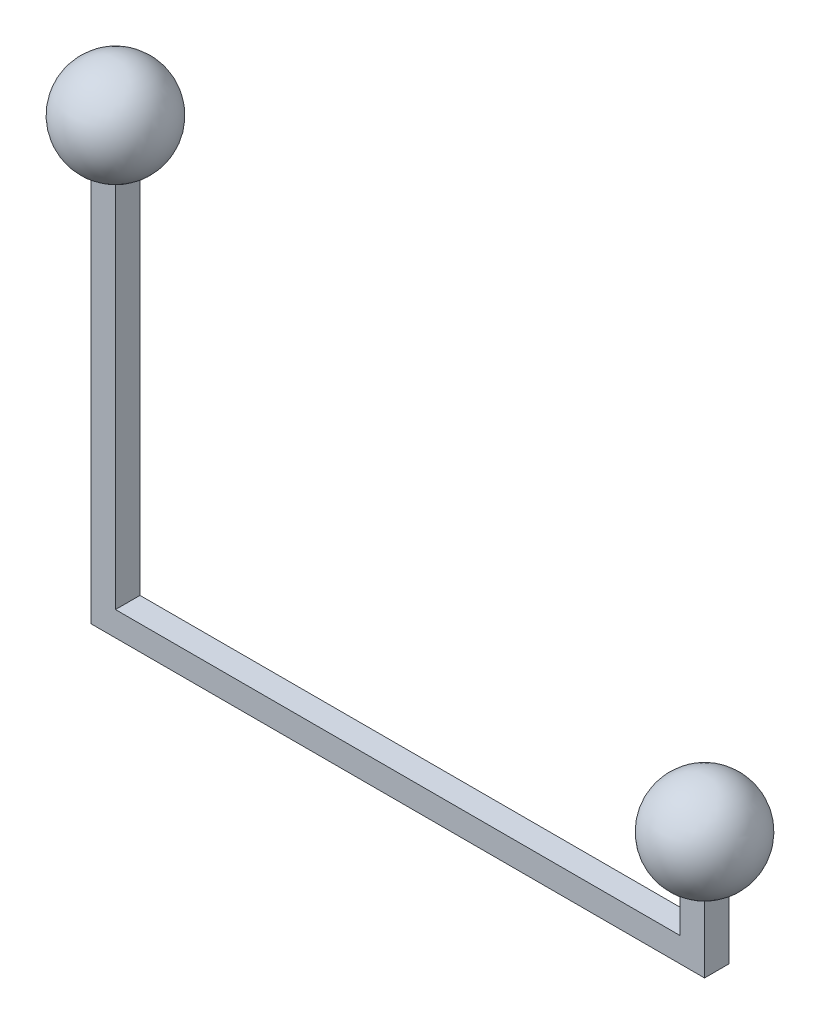
ISO-10303-21;
HEADER;
FILE_DESCRIPTION(('STEP AP214'),'2;1');
FILE_NAME('part.step','',(''),(''),'','','');
FILE_SCHEMA(('AUTOMOTIVE_DESIGN { 1 0 10303 214 1 1 1 1 }'));
ENDSEC;
DATA;
#1=APPLICATION_CONTEXT('core data for automotive mechanical design processes');
#2=APPLICATION_PROTOCOL_DEFINITION('international standard','automotive_design',2000,#1);
#3=PRODUCT_CONTEXT('',#1,'mechanical');
#4=PRODUCT('Part','Part','',(#3));
#5=PRODUCT_RELATED_PRODUCT_CATEGORY('part','',(#4));
#6=PRODUCT_DEFINITION_FORMATION('','',#4);
#7=PRODUCT_DEFINITION_CONTEXT('part definition',#1,'design');
#8=PRODUCT_DEFINITION('design','',#6,#7);
#9=PRODUCT_DEFINITION_SHAPE('','',#8);
#10=(LENGTH_UNIT() NAMED_UNIT(*) SI_UNIT(.MILLI.,.METRE.));
#11=(NAMED_UNIT(*) PLANE_ANGLE_UNIT() SI_UNIT($,.RADIAN.));
#12=(NAMED_UNIT(*) SI_UNIT($,.STERADIAN.) SOLID_ANGLE_UNIT());
#13=UNCERTAINTY_MEASURE_WITH_UNIT(LENGTH_MEASURE(1.E-05),#10,'distance_accuracy_value','');
#14=(GEOMETRIC_REPRESENTATION_CONTEXT(3) GLOBAL_UNCERTAINTY_ASSIGNED_CONTEXT((#13)) GLOBAL_UNIT_ASSIGNED_CONTEXT((#10,
#11,#12)) REPRESENTATION_CONTEXT('',''));
#15=CARTESIAN_POINT('',(0.,0.,0.));
#16=DIRECTION('',(0.,0.,1.));
#17=DIRECTION('',(1.,0.,0.));
#18=AXIS2_PLACEMENT_3D('',#15,#16,#17);
#19=CARTESIAN_POINT('',(79.375,8.63899659242712,3.175));
#20=DIRECTION('',(0.,-1.,0.));
#21=DIRECTION('',(0.,0.,-1.));
#22=AXIS2_PLACEMENT_3D('',#19,#20,#21);
#23=PLANE('',#22);
#24=CARTESIAN_POINT('',(77.7875,8.63899659242712,1.5875));
#25=DIRECTION('',(0.,-1.,0.));
#26=DIRECTION('',(0.,0.,-1.));
#27=AXIS2_PLACEMENT_3D('',#24,#25,#26);
#28=CIRCLE('',#27,1.58749999999999);
#29=CARTESIAN_POINT('',(77.7875,8.63899659242712,0.));
#30=VERTEX_POINT('',#29);
#31=CARTESIAN_POINT('',(76.2,8.63899659242712,1.5875));
#32=VERTEX_POINT('',#31);
#33=EDGE_CURVE('E141',#30,#32,#28,.F.);
#34=ORIENTED_EDGE('',*,*,#33,.F.);
#35=DIRECTION('',(-1.,0.,0.));
#36=VECTOR('',#35,1.);
#37=CARTESIAN_POINT('',(79.375,8.63899659242712,0.));
#38=LINE('',#37,#36);
#39=CARTESIAN_POINT('',(76.2,8.63899659242712,0.));
#40=VERTEX_POINT('',#39);
#41=EDGE_CURVE('E130',#30,#40,#38,.T.);
#42=ORIENTED_EDGE('',*,*,#41,.T.);
#43=DIRECTION('',(0.,0.,-1.));
#44=VECTOR('',#43,1.);
#45=CARTESIAN_POINT('',(76.2,8.63899659242712,3.175));
#46=LINE('',#45,#44);
#47=EDGE_CURVE('E142',#32,#40,#46,.T.);
#48=ORIENTED_EDGE('',*,*,#47,.F.);
#49=EDGE_LOOP('',(#34,#42,#48));
#50=FACE_BOUND('',#49,.T.);
#51=ADVANCED_FACE('F33',(#50),#23,.F.);
#52=CARTESIAN_POINT('',(77.7875,8.63899659242712,3.175));
#53=VERTEX_POINT('',#52);
#54=EDGE_CURVE('E56',#32,#53,#28,.F.);
#55=ORIENTED_EDGE('',*,*,#54,.F.);
#56=CARTESIAN_POINT('',(76.2,8.63899659242712,3.175));
#57=VERTEX_POINT('',#56);
#58=EDGE_CURVE('E206',#57,#32,#46,.T.);
#59=ORIENTED_EDGE('',*,*,#58,.F.);
#60=DIRECTION('',(-1.,0.,0.));
#61=VECTOR('',#60,1.);
#62=CARTESIAN_POINT('',(79.375,8.63899659242712,3.175));
#63=LINE('',#62,#61);
#64=EDGE_CURVE('E163',#53,#57,#63,.T.);
#65=ORIENTED_EDGE('',*,*,#64,.F.);
#66=EDGE_LOOP('',(#55,#59,#65));
#67=FACE_BOUND('',#66,.T.);
#68=ADVANCED_FACE('F245',(#67),#23,.F.);
#69=CARTESIAN_POINT('',(79.375,8.63899659242712,1.5875));
#70=VERTEX_POINT('',#69);
#71=EDGE_CURVE('E149',#53,#70,#28,.F.);
#72=ORIENTED_EDGE('',*,*,#71,.F.);
#73=CARTESIAN_POINT('',(79.375,8.63899659242712,3.175));
#74=VERTEX_POINT('',#73);
#75=EDGE_CURVE('E164',#74,#53,#63,.T.);
#76=ORIENTED_EDGE('',*,*,#75,.F.);
#77=DIRECTION('',(0.,0.,-1.));
#78=VECTOR('',#77,1.);
#79=CARTESIAN_POINT('',(79.375,8.63899659242712,3.175));
#80=LINE('',#79,#78);
#81=EDGE_CURVE('E208',#74,#70,#80,.T.);
#82=ORIENTED_EDGE('',*,*,#81,.T.);
#83=EDGE_LOOP('',(#72,#76,#82));
#84=FACE_BOUND('',#83,.T.);
#85=ADVANCED_FACE('F250',(#84),#23,.F.);
#86=CARTESIAN_POINT('',(3.175,50.8,3.175));
#87=DIRECTION('',(0.,-1.,0.));
#88=DIRECTION('',(0.,0.,-1.));
#89=AXIS2_PLACEMENT_3D('',#86,#87,#88);
#90=PLANE('',#89);
#91=DIRECTION('',(-1.,0.,0.));
#92=VECTOR('',#91,1.);
#93=CARTESIAN_POINT('',(3.175,50.8,0.));
#94=LINE('',#93,#92);
#95=CARTESIAN_POINT('',(3.175,50.8,0.));
#96=VERTEX_POINT('',#95);
#97=CARTESIAN_POINT('',(1.5875,50.8,0.));
#98=VERTEX_POINT('',#97);
#99=EDGE_CURVE('E159',#96,#98,#94,.T.);
#100=ORIENTED_EDGE('',*,*,#99,.T.);
#101=CARTESIAN_POINT('',(1.5875,50.8,1.5875));
#102=DIRECTION('',(0.,-1.,0.));
#103=DIRECTION('',(0.,0.,-1.));
#104=AXIS2_PLACEMENT_3D('',#101,#102,#103);
#105=CIRCLE('',#104,1.5875);
#106=CARTESIAN_POINT('',(3.175,50.8,1.5875));
#107=VERTEX_POINT('',#106);
#108=EDGE_CURVE('E154',#98,#107,#105,.T.);
#109=ORIENTED_EDGE('',*,*,#108,.T.);
#110=DIRECTION('',(0.,0.,-1.));
#111=VECTOR('',#110,1.);
#112=CARTESIAN_POINT('',(3.175,50.8,3.175));
#113=LINE('',#112,#111);
#114=EDGE_CURVE('E196',#107,#96,#113,.T.);
#115=ORIENTED_EDGE('',*,*,#114,.T.);
#116=EDGE_LOOP('',(#100,#109,#115));
#117=FACE_BOUND('',#116,.T.);
#118=ADVANCED_FACE('F231',(#117),#90,.F.);
#119=CARTESIAN_POINT('',(3.175,50.8,3.175));
#120=VERTEX_POINT('',#119);
#121=EDGE_CURVE('E197',#120,#107,#113,.T.);
#122=ORIENTED_EDGE('',*,*,#121,.T.);
#123=CARTESIAN_POINT('',(1.5875,50.8,3.175));
#124=VERTEX_POINT('',#123);
#125=EDGE_CURVE('E393',#107,#124,#105,.T.);
#126=ORIENTED_EDGE('',*,*,#125,.T.);
#127=DIRECTION('',(-1.,0.,0.));
#128=VECTOR('',#127,1.);
#129=CARTESIAN_POINT('',(3.175,50.8,3.175));
#130=LINE('',#129,#128);
#131=EDGE_CURVE('E174',#120,#124,#130,.T.);
#132=ORIENTED_EDGE('',*,*,#131,.F.);
#133=EDGE_LOOP('',(#122,#126,#132));
#134=FACE_BOUND('',#133,.T.);
#135=ADVANCED_FACE('F257',(#134),#90,.F.);
#136=CARTESIAN_POINT('',(0.,50.8,3.175));
#137=VERTEX_POINT('',#136);
#138=EDGE_CURVE('E173',#124,#137,#130,.T.);
#139=ORIENTED_EDGE('',*,*,#138,.F.);
#140=CARTESIAN_POINT('',(0.,50.8,1.5875));
#141=VERTEX_POINT('',#140);
#142=EDGE_CURVE('E153',#124,#141,#105,.T.);
#143=ORIENTED_EDGE('',*,*,#142,.T.);
#144=DIRECTION('',(0.,0.,-1.));
#145=VECTOR('',#144,1.);
#146=CARTESIAN_POINT('',(0.,50.8,3.175));
#147=LINE('',#146,#145);
#148=EDGE_CURVE('E193',#137,#141,#147,.T.);
#149=ORIENTED_EDGE('',*,*,#148,.F.);
#150=EDGE_LOOP('',(#139,#143,#149));
#151=FACE_BOUND('',#150,.T.);
#152=ADVANCED_FACE('F342',(#151),#90,.F.);
#153=CARTESIAN_POINT('',(0.,50.8,3.175));
#154=DIRECTION('',(1.,0.,0.));
#155=DIRECTION('',(0.,1.,0.));
#156=AXIS2_PLACEMENT_3D('',#153,#154,#155);
#157=PLANE('',#156);
#158=DIRECTION('',(0.,-1.,0.));
#159=VECTOR('',#158,1.);
#160=CARTESIAN_POINT('',(0.,50.8,0.));
#161=LINE('',#160,#159);
#162=CARTESIAN_POINT('',(0.,50.8,0.));
#163=VERTEX_POINT('',#162);
#164=CARTESIAN_POINT('',(0.,0.,0.));
#165=VERTEX_POINT('',#164);
#166=EDGE_CURVE('E178',#163,#165,#161,.T.);
#167=ORIENTED_EDGE('',*,*,#166,.T.);
#168=DIRECTION('',(0.,0.,-1.));
#169=VECTOR('',#168,1.);
#170=CARTESIAN_POINT('',(0.,0.,3.175));
#171=LINE('',#170,#169);
#172=CARTESIAN_POINT('',(0.,0.,3.175));
#173=VERTEX_POINT('',#172);
#174=EDGE_CURVE('E11',#173,#165,#171,.T.);
#175=ORIENTED_EDGE('',*,*,#174,.F.);
#176=DIRECTION('',(0.,-1.,0.));
#177=VECTOR('',#176,1.);
#178=CARTESIAN_POINT('',(0.,50.8,3.175));
#179=LINE('',#178,#177);
#180=EDGE_CURVE('E155',#137,#173,#179,.T.);
#181=ORIENTED_EDGE('',*,*,#180,.F.);
#182=ORIENTED_EDGE('',*,*,#148,.T.);
#183=EDGE_CURVE('E177',#141,#163,#147,.T.);
#184=ORIENTED_EDGE('',*,*,#183,.T.);
#185=EDGE_LOOP('',(#167,#175,#181,#182,#184));
#186=FACE_BOUND('',#185,.T.);
#187=ADVANCED_FACE('F35',(#186),#157,.F.);
#188=CARTESIAN_POINT('',(0.,0.,3.175));
#189=DIRECTION('',(0.,1.,0.));
#190=DIRECTION('',(0.,0.,1.));
#191=AXIS2_PLACEMENT_3D('',#188,#189,#190);
#192=PLANE('',#191);
#193=DIRECTION('',(1.,0.,0.));
#194=VECTOR('',#193,1.);
#195=CARTESIAN_POINT('',(0.,0.,0.));
#196=LINE('',#195,#194);
#197=CARTESIAN_POINT('',(79.375,0.,0.));
#198=VERTEX_POINT('',#197);
#199=EDGE_CURVE('E181',#165,#198,#196,.T.);
#200=ORIENTED_EDGE('',*,*,#199,.T.);
#201=DIRECTION('',(0.,0.,-1.));
#202=VECTOR('',#201,1.);
#203=CARTESIAN_POINT('',(79.375,0.,3.175));
#204=LINE('',#203,#202);
#205=CARTESIAN_POINT('',(79.375,0.,3.175));
#206=VERTEX_POINT('',#205);
#207=EDGE_CURVE('E41',#206,#198,#204,.T.);
#208=ORIENTED_EDGE('',*,*,#207,.F.);
#209=DIRECTION('',(1.,0.,0.));
#210=VECTOR('',#209,1.);
#211=CARTESIAN_POINT('',(0.,0.,3.175));
#212=LINE('',#211,#210);
#213=EDGE_CURVE('E158',#173,#206,#212,.T.);
#214=ORIENTED_EDGE('',*,*,#213,.F.);
#215=ORIENTED_EDGE('',*,*,#174,.T.);
#216=EDGE_LOOP('',(#200,#208,#214,#215));
#217=FACE_BOUND('',#216,.T.);
#218=ADVANCED_FACE('F219',(#217),#192,.F.);
#219=CARTESIAN_POINT('',(79.375,0.,3.175));
#220=DIRECTION('',(-1.,0.,0.));
#221=DIRECTION('',(0.,0.,1.));
#222=AXIS2_PLACEMENT_3D('',#219,#220,#221);
#223=PLANE('',#222);
#224=DIRECTION('',(0.,1.,0.));
#225=VECTOR('',#224,1.);
#226=CARTESIAN_POINT('',(79.375,0.,0.));
#227=LINE('',#226,#225);
#228=CARTESIAN_POINT('',(79.375,8.63899659242712,0.));
#229=VERTEX_POINT('',#228);
#230=EDGE_CURVE('E139',#198,#229,#227,.T.);
#231=ORIENTED_EDGE('',*,*,#230,.T.);
#232=EDGE_CURVE('E125',#70,#229,#80,.T.);
#233=ORIENTED_EDGE('',*,*,#232,.F.);
#234=ORIENTED_EDGE('',*,*,#81,.F.);
#235=DIRECTION('',(0.,1.,0.));
#236=VECTOR('',#235,1.);
#237=CARTESIAN_POINT('',(79.375,0.,3.175));
#238=LINE('',#237,#236);
#239=EDGE_CURVE('E161',#206,#74,#238,.T.);
#240=ORIENTED_EDGE('',*,*,#239,.F.);
#241=ORIENTED_EDGE('',*,*,#207,.T.);
#242=EDGE_LOOP('',(#231,#233,#234,#240,#241));
#243=FACE_BOUND('',#242,.T.);
#244=ADVANCED_FACE('F214',(#243),#223,.F.);
#245=EDGE_CURVE('E48',#70,#30,#28,.F.);
#246=ORIENTED_EDGE('',*,*,#245,.F.);
#247=ORIENTED_EDGE('',*,*,#232,.T.);
#248=EDGE_CURVE('E122',#229,#30,#38,.T.);
#249=ORIENTED_EDGE('',*,*,#248,.T.);
#250=EDGE_LOOP('',(#246,#247,#249));
#251=FACE_BOUND('',#250,.T.);
#252=ADVANCED_FACE('F124',(#251),#23,.F.);
#253=CARTESIAN_POINT('',(76.2,8.63899659242712,3.175));
#254=DIRECTION('',(1.,0.,0.));
#255=DIRECTION('',(0.,1.,0.));
#256=AXIS2_PLACEMENT_3D('',#253,#254,#255);
#257=PLANE('',#256);
#258=DIRECTION('',(0.,-1.,0.));
#259=VECTOR('',#258,1.);
#260=CARTESIAN_POINT('',(76.2,8.63899659242712,0.));
#261=LINE('',#260,#259);
#262=CARTESIAN_POINT('',(76.2,3.175,0.));
#263=VERTEX_POINT('',#262);
#264=EDGE_CURVE('E129',#40,#263,#261,.T.);
#265=ORIENTED_EDGE('',*,*,#264,.T.);
#266=DIRECTION('',(0.,0.,-1.));
#267=VECTOR('',#266,1.);
#268=CARTESIAN_POINT('',(76.2,3.175,3.175));
#269=LINE('',#268,#267);
#270=CARTESIAN_POINT('',(76.2,3.175,3.175));
#271=VERTEX_POINT('',#270);
#272=EDGE_CURVE('E203',#271,#263,#269,.T.);
#273=ORIENTED_EDGE('',*,*,#272,.F.);
#274=DIRECTION('',(0.,-1.,0.));
#275=VECTOR('',#274,1.);
#276=CARTESIAN_POINT('',(76.2,8.63899659242712,3.175));
#277=LINE('',#276,#275);
#278=EDGE_CURVE('E167',#57,#271,#277,.T.);
#279=ORIENTED_EDGE('',*,*,#278,.F.);
#280=ORIENTED_EDGE('',*,*,#58,.T.);
#281=ORIENTED_EDGE('',*,*,#47,.T.);
#282=EDGE_LOOP('',(#265,#273,#279,#280,#281));
#283=FACE_BOUND('',#282,.T.);
#284=ADVANCED_FACE('F244',(#283),#257,.F.);
#285=CARTESIAN_POINT('',(76.2,3.175,3.175));
#286=DIRECTION('',(0.,-1.,0.));
#287=DIRECTION('',(1.,0.,0.));
#288=AXIS2_PLACEMENT_3D('',#285,#286,#287);
#289=PLANE('',#288);
#290=DIRECTION('',(-1.,0.,0.));
#291=VECTOR('',#290,1.);
#292=CARTESIAN_POINT('',(76.2,3.175,0.));
#293=LINE('',#292,#291);
#294=CARTESIAN_POINT('',(3.17500000000001,3.17499999999999,0.));
#295=VERTEX_POINT('',#294);
#296=EDGE_CURVE('E185',#263,#295,#293,.T.);
#297=ORIENTED_EDGE('',*,*,#296,.T.);
#298=DIRECTION('',(0.,0.,-1.));
#299=VECTOR('',#298,1.);
#300=CARTESIAN_POINT('',(3.17500000000001,3.17499999999999,3.175));
#301=LINE('',#300,#299);
#302=CARTESIAN_POINT('',(3.17500000000001,3.17499999999999,3.175));
#303=VERTEX_POINT('',#302);
#304=EDGE_CURVE('E200',#303,#295,#301,.T.);
#305=ORIENTED_EDGE('',*,*,#304,.F.);
#306=DIRECTION('',(-1.,0.,0.));
#307=VECTOR('',#306,1.);
#308=CARTESIAN_POINT('',(76.2,3.175,3.175));
#309=LINE('',#308,#307);
#310=EDGE_CURVE('E169',#271,#303,#309,.T.);
#311=ORIENTED_EDGE('',*,*,#310,.F.);
#312=ORIENTED_EDGE('',*,*,#272,.T.);
#313=EDGE_LOOP('',(#297,#305,#311,#312));
#314=FACE_BOUND('',#313,.T.);
#315=ADVANCED_FACE('F239',(#314),#289,.F.);
#316=CARTESIAN_POINT('',(3.17500000000001,3.17499999999999,3.175));
#317=DIRECTION('',(-1.,0.,0.));
#318=DIRECTION('',(0.,-1.,0.));
#319=AXIS2_PLACEMENT_3D('',#316,#317,#318);
#320=PLANE('',#319);
#321=DIRECTION('',(0.,1.,0.));
#322=VECTOR('',#321,1.);
#323=CARTESIAN_POINT('',(3.17500000000001,3.17499999999999,0.));
#324=LINE('',#323,#322);
#325=EDGE_CURVE('E187',#295,#96,#324,.T.);
#326=ORIENTED_EDGE('',*,*,#325,.T.);
#327=ORIENTED_EDGE('',*,*,#114,.F.);
#328=ORIENTED_EDGE('',*,*,#121,.F.);
#329=DIRECTION('',(0.,1.,0.));
#330=VECTOR('',#329,1.);
#331=CARTESIAN_POINT('',(3.17500000000001,3.17499999999999,3.175));
#332=LINE('',#331,#330);
#333=EDGE_CURVE('E171',#303,#120,#332,.T.);
#334=ORIENTED_EDGE('',*,*,#333,.F.);
#335=ORIENTED_EDGE('',*,*,#304,.T.);
#336=EDGE_LOOP('',(#326,#327,#328,#334,#335));
#337=FACE_BOUND('',#336,.T.);
#338=ADVANCED_FACE('F235',(#337),#320,.F.);
#339=ORIENTED_EDGE('',*,*,#183,.F.);
#340=EDGE_CURVE('E145',#141,#98,#105,.T.);
#341=ORIENTED_EDGE('',*,*,#340,.T.);
#342=EDGE_CURVE('E190',#98,#163,#94,.T.);
#343=ORIENTED_EDGE('',*,*,#342,.T.);
#344=EDGE_LOOP('',(#339,#341,#343));
#345=FACE_BOUND('',#344,.T.);
#346=ADVANCED_FACE('F226',(#345),#90,.F.);
#347=CARTESIAN_POINT('',(0.,0.,3.175));
#348=DIRECTION('',(0.,0.,1.));
#349=DIRECTION('',(1.,0.,0.));
#350=AXIS2_PLACEMENT_3D('',#347,#348,#349);
#351=PLANE('',#350);
#352=ORIENTED_EDGE('',*,*,#180,.T.);
#353=ORIENTED_EDGE('',*,*,#213,.T.);
#354=ORIENTED_EDGE('',*,*,#239,.T.);
#355=ORIENTED_EDGE('',*,*,#75,.T.);
#356=ORIENTED_EDGE('',*,*,#64,.T.);
#357=ORIENTED_EDGE('',*,*,#278,.T.);
#358=ORIENTED_EDGE('',*,*,#310,.T.);
#359=ORIENTED_EDGE('',*,*,#333,.T.);
#360=ORIENTED_EDGE('',*,*,#131,.T.);
#361=ORIENTED_EDGE('',*,*,#138,.T.);
#362=EDGE_LOOP('',(#352,#353,#354,#355,#356,#357,#358,#359,#360,#361));
#363=FACE_BOUND('',#362,.T.);
#364=ADVANCED_FACE('F248',(#363),#351,.T.);
#365=CARTESIAN_POINT('',(0.,0.,0.));
#366=DIRECTION('',(0.,0.,1.));
#367=DIRECTION('',(1.,0.,0.));
#368=AXIS2_PLACEMENT_3D('',#365,#366,#367);
#369=PLANE('',#368);
#370=ORIENTED_EDGE('',*,*,#166,.F.);
#371=ORIENTED_EDGE('',*,*,#342,.F.);
#372=ORIENTED_EDGE('',*,*,#99,.F.);
#373=ORIENTED_EDGE('',*,*,#325,.F.);
#374=ORIENTED_EDGE('',*,*,#296,.F.);
#375=ORIENTED_EDGE('',*,*,#264,.F.);
#376=ORIENTED_EDGE('',*,*,#41,.F.);
#377=ORIENTED_EDGE('',*,*,#248,.F.);
#378=ORIENTED_EDGE('',*,*,#230,.F.);
#379=ORIENTED_EDGE('',*,*,#199,.F.);
#380=EDGE_LOOP('',(#370,#371,#372,#373,#374,#375,#376,#377,#378,#379));
#381=FACE_BOUND('',#380,.T.);
#382=ADVANCED_FACE('F136',(#381),#369,.F.);
#383=CARTESIAN_POINT('',(1.5875,56.9483610621043,1.5875));
#384=DIRECTION('',(0.,-1.,0.));
#385=DIRECTION('',(-1.,0.,0.));
#386=AXIS2_PLACEMENT_3D('',#383,#384,#385);
#387=SPHERICAL_SURFACE('',#386,6.35);
#388=ORIENTED_EDGE('',*,*,#108,.F.);
#389=ORIENTED_EDGE('',*,*,#340,.F.);
#390=ORIENTED_EDGE('',*,*,#142,.F.);
#391=ORIENTED_EDGE('',*,*,#125,.F.);
#392=EDGE_LOOP('',(#388,#389,#390,#391));
#393=FACE_BOUND('',#392,.T.);
#394=ADVANCED_FACE('F318',(#393),#387,.T.);
#395=CARTESIAN_POINT('',(77.7875,14.7873576545314,1.5875));
#396=DIRECTION('',(0.,1.,0.));
#397=DIRECTION('',(1.,0.,0.));
#398=AXIS2_PLACEMENT_3D('',#395,#396,#397);
#399=SPHERICAL_SURFACE('',#398,6.35);
#400=ORIENTED_EDGE('',*,*,#245,.T.);
#401=ORIENTED_EDGE('',*,*,#33,.T.);
#402=ORIENTED_EDGE('',*,*,#54,.T.);
#403=ORIENTED_EDGE('',*,*,#71,.T.);
#404=EDGE_LOOP('',(#400,#401,#402,#403));
#405=FACE_BOUND('',#404,.T.);
#406=ADVANCED_FACE('F148',(#405),#399,.T.);
#407=CLOSED_SHELL('',(#51,#68,#85,#118,#135,#152,#187,#218,#244,#252,#284,#315,#338,#346,#364,
#382,#394,#406));
#408=MANIFOLD_SOLID_BREP('B2',#407);
#409=ADVANCED_BREP_SHAPE_REPRESENTATION('',(#18,#408),#14);
#410=SHAPE_DEFINITION_REPRESENTATION(#9,#409);
ENDSEC;
END-ISO-10303-21;
